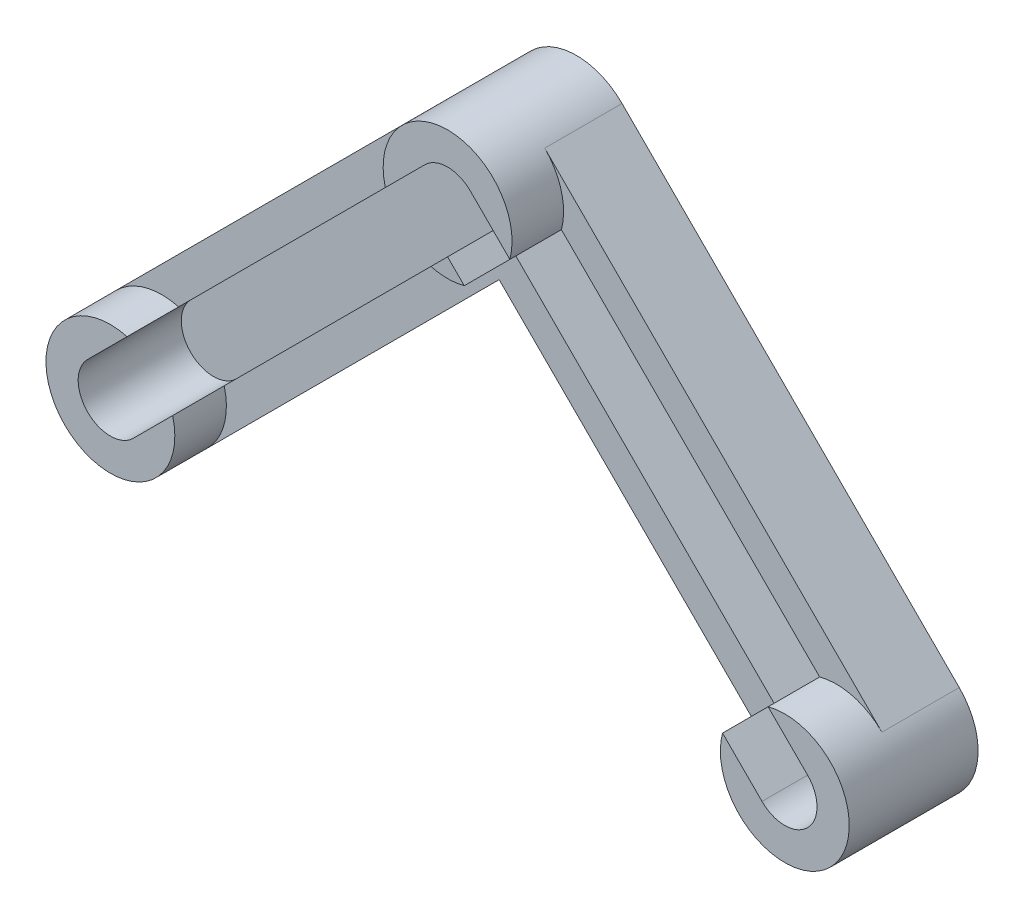
ISO-10303-21;
HEADER;
FILE_DESCRIPTION(('STEP AP214'),'2;1');
FILE_NAME('part.step','',(''),(''),'','','');
FILE_SCHEMA(('AUTOMOTIVE_DESIGN { 1 0 10303 214 1 1 1 1 }'));
ENDSEC;
DATA;
#1=APPLICATION_CONTEXT('core data for automotive mechanical design processes');
#2=APPLICATION_PROTOCOL_DEFINITION('international standard','automotive_design',2000,#1);
#3=PRODUCT_CONTEXT('',#1,'mechanical');
#4=PRODUCT('Part','Part','',(#3));
#5=PRODUCT_RELATED_PRODUCT_CATEGORY('part','',(#4));
#6=PRODUCT_DEFINITION_FORMATION('','',#4);
#7=PRODUCT_DEFINITION_CONTEXT('part definition',#1,'design');
#8=PRODUCT_DEFINITION('design','',#6,#7);
#9=PRODUCT_DEFINITION_SHAPE('','',#8);
#10=(LENGTH_UNIT() NAMED_UNIT(*) SI_UNIT(.MILLI.,.METRE.));
#11=(NAMED_UNIT(*) PLANE_ANGLE_UNIT() SI_UNIT($,.RADIAN.));
#12=(NAMED_UNIT(*) SI_UNIT($,.STERADIAN.) SOLID_ANGLE_UNIT());
#13=UNCERTAINTY_MEASURE_WITH_UNIT(LENGTH_MEASURE(1.E-05),#10,'distance_accuracy_value','');
#14=(GEOMETRIC_REPRESENTATION_CONTEXT(3) GLOBAL_UNCERTAINTY_ASSIGNED_CONTEXT((#13)) GLOBAL_UNIT_ASSIGNED_CONTEXT((#10,
#11,#12)) REPRESENTATION_CONTEXT('',''));
#15=CARTESIAN_POINT('',(0.,0.,0.));
#16=DIRECTION('',(0.,0.,1.));
#17=DIRECTION('',(1.,0.,0.));
#18=AXIS2_PLACEMENT_3D('',#15,#16,#17);
#19=CARTESIAN_POINT('',(14.0770342373392,-25.7488983177718,10.));
#20=DIRECTION('',(0.,0.,-1.));
#21=DIRECTION('',(-1.,0.,0.));
#22=AXIS2_PLACEMENT_3D('',#19,#20,#21);
#23=CYLINDRICAL_SURFACE('',#22,2.5);
#24=DIRECTION('',(0.,0.,-1.));
#25=VECTOR('',#24,1.);
#26=CARTESIAN_POINT('',(15.8448011903056,-23.9811313648055,10.));
#27=LINE('',#26,#25);
#28=CARTESIAN_POINT('',(15.8448011903057,-23.9811313648054,10.));
#29=VERTEX_POINT('',#28);
#30=CARTESIAN_POINT('',(15.8448011903057,-23.9811313648054,2.));
#31=VERTEX_POINT('',#30);
#32=EDGE_CURVE('E11',#29,#31,#27,.T.);
#33=ORIENTED_EDGE('',*,*,#32,.T.);
#34=CARTESIAN_POINT('',(14.0770342373392,-25.7488983177718,2.));
#35=DIRECTION('',(0.,0.,-1.));
#36=DIRECTION('',(-1.,0.,0.));
#37=AXIS2_PLACEMENT_3D('',#34,#35,#36);
#38=CIRCLE('',#37,2.5);
#39=CARTESIAN_POINT('',(12.3092672843729,-27.5166652707382,2.));
#40=VERTEX_POINT('',#39);
#41=EDGE_CURVE('E181',#31,#40,#38,.T.);
#42=ORIENTED_EDGE('',*,*,#41,.T.);
#43=DIRECTION('',(0.,0.,1.));
#44=VECTOR('',#43,1.);
#45=CARTESIAN_POINT('',(12.3092672843729,-27.5166652707382,2.));
#46=LINE('',#45,#44);
#47=CARTESIAN_POINT('',(12.3092672843729,-27.5166652707382,10.));
#48=VERTEX_POINT('',#47);
#49=EDGE_CURVE('E203',#40,#48,#46,.T.);
#50=ORIENTED_EDGE('',*,*,#49,.T.);
#51=CARTESIAN_POINT('',(14.0770342373392,-25.7488983177718,10.));
#52=DIRECTION('',(0.,0.,1.));
#53=DIRECTION('',(1.,0.,0.));
#54=AXIS2_PLACEMENT_3D('',#51,#52,#53);
#55=CIRCLE('',#54,2.5);
#56=EDGE_CURVE('E202',#48,#29,#55,.T.);
#57=ORIENTED_EDGE('',*,*,#56,.T.);
#58=EDGE_LOOP('',(#33,#42,#50,#57));
#59=FACE_BOUND('',#58,.T.);
#60=ADVANCED_FACE('F32',(#59),#23,.F.);
#61=CARTESIAN_POINT('',(-12.085916666563,0.414052586130462,10.));
#62=DIRECTION('',(0.,0.,-1.));
#63=DIRECTION('',(-1.,0.,0.));
#64=AXIS2_PLACEMENT_3D('',#61,#62,#63);
#65=CYLINDRICAL_SURFACE('',#64,5.);
#66=CARTESIAN_POINT('',(-12.085916666563,0.414052586130462,6.));
#67=DIRECTION('',(0.,0.,1.));
#68=DIRECTION('',(1.,0.,0.));
#69=AXIS2_PLACEMENT_3D('',#66,#67,#68);
#70=CIRCLE('',#69,5.);
#71=CARTESIAN_POINT('',(-13.3800118920756,-4.41557654531488,6.));
#72=VERTEX_POINT('',#71);
#73=CARTESIAN_POINT('',(-10.7918214410505,-4.41557654531489,6.));
#74=VERTEX_POINT('',#73);
#75=EDGE_CURVE('E278',#72,#74,#70,.T.);
#76=ORIENTED_EDGE('',*,*,#75,.T.);
#77=DIRECTION('',(0.,0.,-1.));
#78=VECTOR('',#77,1.);
#79=CARTESIAN_POINT('',(-10.7918214410505,-4.4155765453149,10.));
#80=LINE('',#79,#78);
#81=CARTESIAN_POINT('',(-10.7918214410505,-4.4155765453149,10.));
#82=VERTEX_POINT('',#81);
#83=EDGE_CURVE('E339',#74,#82,#80,.F.);
#84=ORIENTED_EDGE('',*,*,#83,.T.);
#85=CARTESIAN_POINT('',(-12.085916666563,0.414052586130462,10.));
#86=DIRECTION('',(0.,0.,1.));
#87=DIRECTION('',(1.,0.,0.));
#88=AXIS2_PLACEMENT_3D('',#85,#86,#87);
#89=CIRCLE('',#88,5.);
#90=CARTESIAN_POINT('',(-13.3800118920756,-4.41557654531488,10.));
#91=VERTEX_POINT('',#90);
#92=EDGE_CURVE('E281',#91,#82,#89,.T.);
#93=ORIENTED_EDGE('',*,*,#92,.F.);
#94=DIRECTION('',(0.,0.,-1.));
#95=VECTOR('',#94,1.);
#96=CARTESIAN_POINT('',(-13.3800118920756,-4.41557654531488,10.));
#97=LINE('',#96,#95);
#98=EDGE_CURVE('E346',#72,#91,#97,.F.);
#99=ORIENTED_EDGE('',*,*,#98,.F.);
#100=EDGE_LOOP('',(#76,#84,#93,#99));
#101=FACE_BOUND('',#100,.T.);
#102=ADVANCED_FACE('F344',(#101),#65,.T.);
#103=CARTESIAN_POINT('',(-12.085916666563,0.414052586130462,10.));
#104=DIRECTION('',(0.,0.,1.));
#105=DIRECTION('',(1.,0.,0.));
#106=AXIS2_PLACEMENT_3D('',#103,#104,#105);
#107=PLANE('',#106);
#108=DIRECTION('',(0.707106781186548,-0.707106781186547,0.));
#109=VECTOR('',#108,1.);
#110=CARTESIAN_POINT('',(12.3092672843729,-27.5166652707382,10.));
#111=LINE('',#110,#109);
#112=CARTESIAN_POINT('',(-12.085916666563,-3.12148131980232,10.));
#113=VERTEX_POINT('',#112);
#114=EDGE_CURVE('E198',#113,#82,#111,.T.);
#115=ORIENTED_EDGE('',*,*,#114,.F.);
#116=DIRECTION('',(0.707106781186547,0.707106781186548,0.));
#117=VECTOR('',#116,1.);
#118=CARTESIAN_POINT('',(-10.3181497135966,-1.35371436683589,10.));
#119=LINE('',#118,#117);
#120=EDGE_CURVE('E374',#91,#113,#119,.T.);
#121=ORIENTED_EDGE('',*,*,#120,.F.);
#122=ORIENTED_EDGE('',*,*,#92,.T.);
#123=EDGE_LOOP('',(#115,#121,#122));
#124=FACE_BOUND('',#123,.T.);
#125=ADVANCED_FACE('F427',(#124),#107,.T.);
#126=CARTESIAN_POINT('',(0.,0.,6.));
#127=DIRECTION('',(0.,0.,1.));
#128=DIRECTION('',(1.,0.,0.));
#129=AXIS2_PLACEMENT_3D('',#126,#127,#128);
#130=PLANE('',#129);
#131=DIRECTION('',(0.707106781186548,-0.707106781186547,0.));
#132=VECTOR('',#131,1.);
#133=CARTESIAN_POINT('',(-7.60369899318268,-7.60369899318268,6.));
#134=LINE('',#133,#132);
#135=CARTESIAN_POINT('',(9.24740510589387,-24.4548030922592,6.));
#136=VERTEX_POINT('',#135);
#137=EDGE_CURVE('E336',#74,#136,#134,.T.);
#138=ORIENTED_EDGE('',*,*,#137,.F.);
#139=ORIENTED_EDGE('',*,*,#75,.F.);
#140=DIRECTION('',(0.707106781186547,0.707106781186548,0.));
#141=VECTOR('',#140,1.);
#142=CARTESIAN_POINT('',(-10.3181497135966,-1.35371436683589,6.));
#143=LINE('',#142,#141);
#144=CARTESIAN_POINT('',(-33.4192384390202,-24.4548030922595,6.));
#145=VERTEX_POINT('',#144);
#146=EDGE_CURVE('E300',#145,#72,#143,.T.);
#147=ORIENTED_EDGE('',*,*,#146,.F.);
#148=CARTESIAN_POINT('',(-38.2488675704654,-25.7488983177717,6.));
#149=DIRECTION('',(0.,0.,1.));
#150=DIRECTION('',(1.,0.,0.));
#151=AXIS2_PLACEMENT_3D('',#148,#149,#150);
#152=CIRCLE('',#151,4.99999999999975);
#153=CARTESIAN_POINT('',(-34.7133336645327,-29.2844322237044,6.));
#154=VERTEX_POINT('',#153);
#155=EDGE_CURVE('E284',#145,#154,#152,.F.);
#156=ORIENTED_EDGE('',*,*,#155,.T.);
#157=DIRECTION('',(-0.707106781186551,-0.707106781186544,0.));
#158=VECTOR('',#157,1.);
#159=CARTESIAN_POINT('',(-34.7133336645327,-29.2844322237044,6.));
#160=LINE('',#159,#158);
#161=CARTESIAN_POINT('',(-12.0859166665631,-6.65701522573503,6.));
#162=VERTEX_POINT('',#161);
#163=EDGE_CURVE('E257',#162,#154,#160,.T.);
#164=ORIENTED_EDGE('',*,*,#163,.F.);
#165=DIRECTION('',(-0.707106781186547,0.707106781186547,0.));
#166=VECTOR('',#165,1.);
#167=CARTESIAN_POINT('',(-15.6214505724958,-3.12148131980235,6.));
#168=LINE('',#167,#166);
#169=CARTESIAN_POINT('',(10.5415003314065,-29.2844322237046,6.));
#170=VERTEX_POINT('',#169);
#171=EDGE_CURVE('E224',#170,#162,#168,.T.);
#172=ORIENTED_EDGE('',*,*,#171,.F.);
#173=CARTESIAN_POINT('',(14.0770342373392,-25.7488983177718,6.));
#174=DIRECTION('',(0.,0.,1.));
#175=DIRECTION('',(1.,0.,0.));
#176=AXIS2_PLACEMENT_3D('',#173,#174,#175);
#177=CIRCLE('',#176,5.);
#178=EDGE_CURVE('E221',#170,#136,#177,.F.);
#179=ORIENTED_EDGE('',*,*,#178,.T.);
#180=EDGE_LOOP('',(#138,#139,#147,#156,#164,#172,#179));
#181=FACE_BOUND('',#180,.T.);
#182=ADVANCED_FACE('F296',(#181),#130,.T.);
#183=CARTESIAN_POINT('',(-38.2488675704654,-25.7488983177717,10.));
#184=DIRECTION('',(0.,0.,-1.));
#185=DIRECTION('',(-1.,0.,0.));
#186=AXIS2_PLACEMENT_3D('',#183,#184,#185);
#187=CYLINDRICAL_SURFACE('',#186,2.49999999999976);
#188=DIRECTION('',(0.,0.,1.));
#189=VECTOR('',#188,1.);
#190=CARTESIAN_POINT('',(-40.0166345234318,-23.9811313648053,2.));
#191=LINE('',#190,#189);
#192=CARTESIAN_POINT('',(-40.0166345234318,-23.9811313648053,2.));
#193=VERTEX_POINT('',#192);
#194=CARTESIAN_POINT('',(-40.0166345234318,-23.9811313648053,10.));
#195=VERTEX_POINT('',#194);
#196=EDGE_CURVE('E214',#193,#195,#191,.T.);
#197=ORIENTED_EDGE('',*,*,#196,.T.);
#198=CARTESIAN_POINT('',(-38.2488675704654,-25.7488983177717,10.));
#199=DIRECTION('',(0.,0.,1.));
#200=DIRECTION('',(1.,0.,0.));
#201=AXIS2_PLACEMENT_3D('',#198,#199,#200);
#202=CIRCLE('',#201,2.49999999999976);
#203=CARTESIAN_POINT('',(-36.4811006174989,-27.5166652707382,10.));
#204=VERTEX_POINT('',#203);
#205=EDGE_CURVE('E244',#195,#204,#202,.T.);
#206=ORIENTED_EDGE('',*,*,#205,.T.);
#207=DIRECTION('',(0.,0.,-1.));
#208=VECTOR('',#207,1.);
#209=CARTESIAN_POINT('',(-36.4811006174992,-27.5166652707379,10.));
#210=LINE('',#209,#208);
#211=CARTESIAN_POINT('',(-36.4811006174992,-27.5166652707379,2.));
#212=VERTEX_POINT('',#211);
#213=EDGE_CURVE('E251',#204,#212,#210,.T.);
#214=ORIENTED_EDGE('',*,*,#213,.T.);
#215=CARTESIAN_POINT('',(-38.2488675704654,-25.7488983177717,2.));
#216=DIRECTION('',(0.,0.,-1.));
#217=DIRECTION('',(-1.,0.,0.));
#218=AXIS2_PLACEMENT_3D('',#215,#216,#217);
#219=CIRCLE('',#218,2.49999999999973);
#220=EDGE_CURVE('E366',#212,#193,#219,.T.);
#221=ORIENTED_EDGE('',*,*,#220,.T.);
#222=EDGE_LOOP('',(#197,#206,#214,#221));
#223=FACE_BOUND('',#222,.T.);
#224=ADVANCED_FACE('F410',(#223),#187,.F.);
#225=CARTESIAN_POINT('',(-12.085916666563,0.414052586130462,10.));
#226=DIRECTION('',(0.,0.,-1.));
#227=DIRECTION('',(-1.,0.,0.));
#228=AXIS2_PLACEMENT_3D('',#225,#226,#227);
#229=CYLINDRICAL_SURFACE('',#228,2.5);
#230=DIRECTION('',(0.,0.,-1.));
#231=VECTOR('',#230,1.);
#232=CARTESIAN_POINT('',(-10.3181497135966,2.1818195390968,10.));
#233=LINE('',#232,#231);
#234=CARTESIAN_POINT('',(-10.3181497135966,2.1818195390969,10.));
#235=VERTEX_POINT('',#234);
#236=CARTESIAN_POINT('',(-10.3181497135966,2.1818195390968,2.));
#237=VERTEX_POINT('',#236);
#238=EDGE_CURVE('E196',#235,#237,#233,.T.);
#239=ORIENTED_EDGE('',*,*,#238,.F.);
#240=CARTESIAN_POINT('',(-12.085916666563,0.414052586130462,10.));
#241=DIRECTION('',(0.,0.,1.));
#242=DIRECTION('',(1.,0.,0.));
#243=AXIS2_PLACEMENT_3D('',#240,#241,#242);
#244=CIRCLE('',#243,2.5);
#245=CARTESIAN_POINT('',(-13.8536836195295,2.18181953909697,10.));
#246=VERTEX_POINT('',#245);
#247=EDGE_CURVE('E277',#235,#246,#244,.T.);
#248=ORIENTED_EDGE('',*,*,#247,.T.);
#249=DIRECTION('',(0.,0.,1.));
#250=VECTOR('',#249,1.);
#251=CARTESIAN_POINT('',(-13.8536836195295,2.18181953909697,2.));
#252=LINE('',#251,#250);
#253=CARTESIAN_POINT('',(-13.8536836195294,2.18181953909683,2.));
#254=VERTEX_POINT('',#253);
#255=EDGE_CURVE('E208',#254,#246,#252,.T.);
#256=ORIENTED_EDGE('',*,*,#255,.F.);
#257=CARTESIAN_POINT('',(-12.085916666563,0.414052586130462,2.));
#258=DIRECTION('',(0.,0.,-1.));
#259=DIRECTION('',(-1.,0.,0.));
#260=AXIS2_PLACEMENT_3D('',#257,#258,#259);
#261=CIRCLE('',#260,2.5);
#262=EDGE_CURVE('E361',#254,#237,#261,.T.);
#263=ORIENTED_EDGE('',*,*,#262,.T.);
#264=EDGE_LOOP('',(#239,#248,#256,#263));
#265=FACE_BOUND('',#264,.T.);
#266=ADVANCED_FACE('F400',(#265),#229,.F.);
#267=CARTESIAN_POINT('',(-7.25628753511764,-0.880042639382038,10.));
#268=VERTEX_POINT('',#267);
#269=CARTESIAN_POINT('',(-16.9155457980084,-0.880042639381941,10.));
#270=VERTEX_POINT('',#269);
#271=EDGE_CURVE('E285',#268,#270,#89,.T.);
#272=ORIENTED_EDGE('',*,*,#271,.F.);
#273=DIRECTION('',(0.,0.,-1.));
#274=VECTOR('',#273,1.);
#275=CARTESIAN_POINT('',(-7.25628753511764,-0.880042639382036,10.));
#276=LINE('',#275,#274);
#277=CARTESIAN_POINT('',(-7.25628753511764,-0.880042639382037,6.));
#278=VERTEX_POINT('',#277);
#279=EDGE_CURVE('E379',#268,#278,#276,.T.);
#280=ORIENTED_EDGE('',*,*,#279,.T.);
#281=CARTESIAN_POINT('',(-8.55038276063024,3.94958649206317,6.));
#282=VERTEX_POINT('',#281);
#283=EDGE_CURVE('E269',#278,#282,#70,.T.);
#284=ORIENTED_EDGE('',*,*,#283,.T.);
#285=DIRECTION('',(0.,0.,-1.));
#286=VECTOR('',#285,1.);
#287=CARTESIAN_POINT('',(-8.55038276063024,3.94958649206317,6.));
#288=LINE('',#287,#286);
#289=CARTESIAN_POINT('',(-8.55038276063024,3.94958649206317,0.));
#290=VERTEX_POINT('',#289);
#291=EDGE_CURVE('E237',#282,#290,#288,.T.);
#292=ORIENTED_EDGE('',*,*,#291,.T.);
#293=CARTESIAN_POINT('',(-12.085916666563,0.414052586130462,0.));
#294=DIRECTION('',(0.,0.,1.));
#295=DIRECTION('',(1.,0.,0.));
#296=AXIS2_PLACEMENT_3D('',#293,#294,#295);
#297=CIRCLE('',#296,5.);
#298=CARTESIAN_POINT('',(-15.6214505724957,3.94958649206322,0.));
#299=VERTEX_POINT('',#298);
#300=EDGE_CURVE('E280',#290,#299,#297,.T.);
#301=ORIENTED_EDGE('',*,*,#300,.T.);
#302=DIRECTION('',(0.,0.,-1.));
#303=VECTOR('',#302,1.);
#304=CARTESIAN_POINT('',(-15.6214505724957,3.94958649206319,6.));
#305=LINE('',#304,#303);
#306=CARTESIAN_POINT('',(-15.6214505724957,3.94958649206322,6.));
#307=VERTEX_POINT('',#306);
#308=EDGE_CURVE('E55',#307,#299,#305,.T.);
#309=ORIENTED_EDGE('',*,*,#308,.F.);
#310=CARTESIAN_POINT('',(-16.9155457980084,-0.880042639381941,6.));
#311=VERTEX_POINT('',#310);
#312=EDGE_CURVE('E275',#307,#311,#70,.T.);
#313=ORIENTED_EDGE('',*,*,#312,.T.);
#314=DIRECTION('',(0.,0.,-1.));
#315=VECTOR('',#314,1.);
#316=CARTESIAN_POINT('',(-16.9155457980084,-0.880042639381937,10.));
#317=LINE('',#316,#315);
#318=EDGE_CURVE('E368',#270,#311,#317,.T.);
#319=ORIENTED_EDGE('',*,*,#318,.F.);
#320=EDGE_LOOP('',(#272,#280,#284,#292,#301,#309,#313,#319));
#321=FACE_BOUND('',#320,.T.);
#322=ADVANCED_FACE('F34',(#321),#65,.T.);
#323=DIRECTION('',(-0.707106781186548,0.707106781186547,0.));
#324=VECTOR('',#323,1.);
#325=CARTESIAN_POINT('',(-10.3181497135966,2.1818195390969,10.));
#326=LINE('',#325,#324);
#327=EDGE_CURVE('E190',#268,#235,#326,.T.);
#328=ORIENTED_EDGE('',*,*,#327,.F.);
#329=ORIENTED_EDGE('',*,*,#271,.T.);
#330=DIRECTION('',(-0.707106781186547,-0.707106781186547,0.));
#331=VECTOR('',#330,1.);
#332=CARTESIAN_POINT('',(-40.0166345234318,-23.9811313648053,10.));
#333=LINE('',#332,#331);
#334=EDGE_CURVE('E375',#246,#270,#333,.T.);
#335=ORIENTED_EDGE('',*,*,#334,.F.);
#336=ORIENTED_EDGE('',*,*,#247,.F.);
#337=EDGE_LOOP('',(#328,#329,#335,#336));
#338=FACE_BOUND('',#337,.T.);
#339=ADVANCED_FACE('F397',(#338),#107,.T.);
#340=CARTESIAN_POINT('',(-38.2488675704654,-25.7488983177717,10.));
#341=DIRECTION('',(0.,0.,1.));
#342=DIRECTION('',(1.,0.,0.));
#343=AXIS2_PLACEMENT_3D('',#340,#341,#342);
#344=PLANE('',#343);
#345=ORIENTED_EDGE('',*,*,#205,.F.);
#346=CARTESIAN_POINT('',(-36.954772344953,-20.9192691863265,10.));
#347=VERTEX_POINT('',#346);
#348=EDGE_CURVE('E378',#347,#195,#333,.T.);
#349=ORIENTED_EDGE('',*,*,#348,.F.);
#350=CARTESIAN_POINT('',(-38.2488675704654,-25.7488983177717,10.));
#351=DIRECTION('',(0.,0.,1.));
#352=DIRECTION('',(1.,0.,0.));
#353=AXIS2_PLACEMENT_3D('',#350,#351,#352);
#354=CIRCLE('',#353,4.99999999999975);
#355=CARTESIAN_POINT('',(-33.4192384390202,-24.4548030922595,10.));
#356=VERTEX_POINT('',#355);
#357=EDGE_CURVE('E248',#347,#356,#354,.T.);
#358=ORIENTED_EDGE('',*,*,#357,.T.);
#359=EDGE_CURVE('E372',#204,#356,#119,.T.);
#360=ORIENTED_EDGE('',*,*,#359,.F.);
#361=EDGE_LOOP('',(#345,#349,#358,#360));
#362=FACE_BOUND('',#361,.T.);
#363=ADVANCED_FACE('F414',(#362),#344,.T.);
#364=CARTESIAN_POINT('',(-38.2488675704654,-25.7488983177717,10.));
#365=DIRECTION('',(0.,0.,-1.));
#366=DIRECTION('',(-1.,0.,0.));
#367=AXIS2_PLACEMENT_3D('',#364,#365,#366);
#368=CYLINDRICAL_SURFACE('',#367,4.99999999999975);
#369=DIRECTION('',(0.,0.,-1.));
#370=VECTOR('',#369,1.);
#371=CARTESIAN_POINT('',(-36.954772344953,-20.9192691863265,10.));
#372=LINE('',#371,#370);
#373=CARTESIAN_POINT('',(-36.954772344953,-20.9192691863265,6.));
#374=VERTEX_POINT('',#373);
#375=EDGE_CURVE('E350',#374,#347,#372,.F.);
#376=ORIENTED_EDGE('',*,*,#375,.F.);
#377=CARTESIAN_POINT('',(-41.7844014763981,-22.2133644118389,6.));
#378=VERTEX_POINT('',#377);
#379=EDGE_CURVE('E40',#378,#374,#152,.F.);
#380=ORIENTED_EDGE('',*,*,#379,.F.);
#381=DIRECTION('',(0.,0.,-1.));
#382=VECTOR('',#381,1.);
#383=CARTESIAN_POINT('',(-41.7844014763981,-22.2133644118389,6.));
#384=LINE('',#383,#382);
#385=CARTESIAN_POINT('',(-41.7844014763981,-22.2133644118389,0.));
#386=VERTEX_POINT('',#385);
#387=EDGE_CURVE('E270',#378,#386,#384,.T.);
#388=ORIENTED_EDGE('',*,*,#387,.T.);
#389=CARTESIAN_POINT('',(-38.2488675704654,-25.7488983177717,0.));
#390=DIRECTION('',(0.,0.,1.));
#391=DIRECTION('',(1.,0.,0.));
#392=AXIS2_PLACEMENT_3D('',#389,#390,#391);
#393=CIRCLE('',#392,4.99999999999975);
#394=CARTESIAN_POINT('',(-34.7133336645327,-29.2844322237044,0.));
#395=VERTEX_POINT('',#394);
#396=EDGE_CURVE('E247',#386,#395,#393,.T.);
#397=ORIENTED_EDGE('',*,*,#396,.T.);
#398=DIRECTION('',(0.,0.,-1.));
#399=VECTOR('',#398,1.);
#400=CARTESIAN_POINT('',(-34.7133336645327,-29.2844322237044,6.));
#401=LINE('',#400,#399);
#402=EDGE_CURVE('E264',#154,#395,#401,.T.);
#403=ORIENTED_EDGE('',*,*,#402,.F.);
#404=ORIENTED_EDGE('',*,*,#155,.F.);
#405=DIRECTION('',(0.,0.,-1.));
#406=VECTOR('',#405,1.);
#407=CARTESIAN_POINT('',(-33.4192384390202,-24.4548030922595,10.));
#408=LINE('',#407,#406);
#409=EDGE_CURVE('E351',#356,#145,#408,.T.);
#410=ORIENTED_EDGE('',*,*,#409,.F.);
#411=ORIENTED_EDGE('',*,*,#357,.F.);
#412=EDGE_LOOP('',(#376,#380,#388,#397,#403,#404,#410,#411));
#413=FACE_BOUND('',#412,.T.);
#414=ADVANCED_FACE('F308',(#413),#368,.T.);
#415=DIRECTION('',(-0.707106781186547,-0.707106781186547,0.));
#416=VECTOR('',#415,1.);
#417=CARTESIAN_POINT('',(-40.0166345234318,-23.9811313648053,6.));
#418=LINE('',#417,#416);
#419=EDGE_CURVE('E355',#311,#374,#418,.T.);
#420=ORIENTED_EDGE('',*,*,#419,.F.);
#421=ORIENTED_EDGE('',*,*,#312,.F.);
#422=DIRECTION('',(0.707106781186551,0.707106781186544,0.));
#423=VECTOR('',#422,1.);
#424=CARTESIAN_POINT('',(-15.6214505724957,3.94958649206319,6.));
#425=LINE('',#424,#423);
#426=EDGE_CURVE('E260',#378,#307,#425,.T.);
#427=ORIENTED_EDGE('',*,*,#426,.F.);
#428=ORIENTED_EDGE('',*,*,#379,.T.);
#429=EDGE_LOOP('',(#420,#421,#427,#428));
#430=FACE_BOUND('',#429,.T.);
#431=ADVANCED_FACE('F416',(#430),#130,.T.);
#432=CARTESIAN_POINT('',(-12.085916666563,0.414052586130462,0.));
#433=DIRECTION('',(0.,0.,1.));
#434=DIRECTION('',(1.,0.,0.));
#435=AXIS2_PLACEMENT_3D('',#432,#433,#434);
#436=PLANE('',#435);
#437=DIRECTION('',(0.707106781186551,0.707106781186544,0.));
#438=VECTOR('',#437,1.);
#439=CARTESIAN_POINT('',(-15.6214505724957,3.94958649206319,0.));
#440=LINE('',#439,#438);
#441=EDGE_CURVE('E261',#386,#299,#440,.T.);
#442=ORIENTED_EDGE('',*,*,#441,.T.);
#443=ORIENTED_EDGE('',*,*,#300,.F.);
#444=DIRECTION('',(0.707106781186546,-0.707106781186548,0.));
#445=VECTOR('',#444,1.);
#446=CARTESIAN_POINT('',(17.612568143272,-22.2133644118391,0.));
#447=LINE('',#446,#445);
#448=CARTESIAN_POINT('',(17.612568143272,-22.2133644118391,0.));
#449=VERTEX_POINT('',#448);
#450=EDGE_CURVE('E227',#290,#449,#447,.T.);
#451=ORIENTED_EDGE('',*,*,#450,.T.);
#452=CARTESIAN_POINT('',(14.0770342373392,-25.7488983177718,0.));
#453=DIRECTION('',(0.,0.,1.));
#454=DIRECTION('',(1.,0.,0.));
#455=AXIS2_PLACEMENT_3D('',#452,#453,#454);
#456=CIRCLE('',#455,5.);
#457=CARTESIAN_POINT('',(10.5415003314065,-29.2844322237046,0.));
#458=VERTEX_POINT('',#457);
#459=EDGE_CURVE('E207',#458,#449,#456,.T.);
#460=ORIENTED_EDGE('',*,*,#459,.F.);
#461=DIRECTION('',(-0.707106781186547,0.707106781186547,0.));
#462=VECTOR('',#461,1.);
#463=CARTESIAN_POINT('',(-15.6214505724958,-3.12148131980235,0.));
#464=LINE('',#463,#462);
#465=CARTESIAN_POINT('',(-12.0859166665631,-6.65701522573503,0.));
#466=VERTEX_POINT('',#465);
#467=EDGE_CURVE('E47',#458,#466,#464,.T.);
#468=ORIENTED_EDGE('',*,*,#467,.T.);
#469=DIRECTION('',(-0.707106781186551,-0.707106781186544,0.));
#470=VECTOR('',#469,1.);
#471=CARTESIAN_POINT('',(-34.7133336645327,-29.2844322237044,0.));
#472=LINE('',#471,#470);
#473=EDGE_CURVE('E256',#466,#395,#472,.T.);
#474=ORIENTED_EDGE('',*,*,#473,.T.);
#475=ORIENTED_EDGE('',*,*,#396,.F.);
#476=EDGE_LOOP('',(#442,#443,#451,#460,#468,#474,#475));
#477=FACE_BOUND('',#476,.T.);
#478=ADVANCED_FACE('F310',(#477),#436,.F.);
#479=CARTESIAN_POINT('',(-15.6214505724957,3.94958649206319,6.));
#480=DIRECTION('',(-0.707106781186544,0.707106781186551,0.));
#481=DIRECTION('',(-0.707106781186551,-0.707106781186544,0.));
#482=AXIS2_PLACEMENT_3D('',#479,#480,#481);
#483=PLANE('',#482);
#484=ORIENTED_EDGE('',*,*,#441,.F.);
#485=ORIENTED_EDGE('',*,*,#387,.F.);
#486=ORIENTED_EDGE('',*,*,#426,.T.);
#487=ORIENTED_EDGE('',*,*,#308,.T.);
#488=EDGE_LOOP('',(#484,#485,#486,#487));
#489=FACE_BOUND('',#488,.T.);
#490=ADVANCED_FACE('F313',(#489),#483,.T.);
#491=CARTESIAN_POINT('',(-34.7133336645327,-29.2844322237044,6.));
#492=DIRECTION('',(0.707106781186544,-0.707106781186551,0.));
#493=DIRECTION('',(0.707106781186551,0.707106781186544,0.));
#494=AXIS2_PLACEMENT_3D('',#491,#492,#493);
#495=PLANE('',#494);
#496=DIRECTION('',(0.,0.,-1.));
#497=VECTOR('',#496,1.);
#498=CARTESIAN_POINT('',(-12.0859166665631,-6.65701522573503,6.));
#499=LINE('',#498,#497);
#500=EDGE_CURVE('E236',#162,#466,#499,.T.);
#501=ORIENTED_EDGE('',*,*,#500,.F.);
#502=ORIENTED_EDGE('',*,*,#163,.T.);
#503=ORIENTED_EDGE('',*,*,#402,.T.);
#504=ORIENTED_EDGE('',*,*,#473,.F.);
#505=EDGE_LOOP('',(#501,#502,#503,#504));
#506=FACE_BOUND('',#505,.T.);
#507=ADVANCED_FACE('F306',(#506),#495,.T.);
#508=DIRECTION('',(-0.707106781186548,0.707106781186547,0.));
#509=VECTOR('',#508,1.);
#510=CARTESIAN_POINT('',(-4.06816508724984,-4.06816508724984,6.));
#511=LINE('',#510,#509);
#512=CARTESIAN_POINT('',(12.7829390118268,-20.9192691863264,6.));
#513=VERTEX_POINT('',#512);
#514=EDGE_CURVE('E326',#513,#278,#511,.T.);
#515=ORIENTED_EDGE('',*,*,#514,.F.);
#516=CARTESIAN_POINT('',(17.612568143272,-22.2133644118391,6.));
#517=VERTEX_POINT('',#516);
#518=EDGE_CURVE('E219',#513,#517,#177,.F.);
#519=ORIENTED_EDGE('',*,*,#518,.T.);
#520=DIRECTION('',(0.707106781186546,-0.707106781186548,0.));
#521=VECTOR('',#520,1.);
#522=CARTESIAN_POINT('',(17.612568143272,-22.2133644118391,6.));
#523=LINE('',#522,#521);
#524=EDGE_CURVE('E226',#282,#517,#523,.T.);
#525=ORIENTED_EDGE('',*,*,#524,.F.);
#526=ORIENTED_EDGE('',*,*,#283,.F.);
#527=EDGE_LOOP('',(#515,#519,#525,#526));
#528=FACE_BOUND('',#527,.T.);
#529=ADVANCED_FACE('F324',(#528),#130,.T.);
#530=CARTESIAN_POINT('',(-15.6214505724958,-3.12148131980235,6.));
#531=DIRECTION('',(-0.707106781186548,-0.707106781186548,0.));
#532=DIRECTION('',(0.707106781186548,-0.707106781186548,0.));
#533=AXIS2_PLACEMENT_3D('',#530,#531,#532);
#534=PLANE('',#533);
#535=ORIENTED_EDGE('',*,*,#171,.T.);
#536=ORIENTED_EDGE('',*,*,#500,.T.);
#537=ORIENTED_EDGE('',*,*,#467,.F.);
#538=DIRECTION('',(0.,0.,-1.));
#539=VECTOR('',#538,1.);
#540=CARTESIAN_POINT('',(10.5415003314065,-29.2844322237046,6.));
#541=LINE('',#540,#539);
#542=EDGE_CURVE('E230',#170,#458,#541,.T.);
#543=ORIENTED_EDGE('',*,*,#542,.F.);
#544=EDGE_LOOP('',(#535,#536,#537,#543));
#545=FACE_BOUND('',#544,.T.);
#546=ADVANCED_FACE('F335',(#545),#534,.T.);
#547=CARTESIAN_POINT('',(17.612568143272,-22.2133644118391,6.));
#548=DIRECTION('',(0.707106781186549,0.707106781186547,0.));
#549=DIRECTION('',(-0.707106781186547,0.707106781186549,0.));
#550=AXIS2_PLACEMENT_3D('',#547,#548,#549);
#551=PLANE('',#550);
#552=ORIENTED_EDGE('',*,*,#450,.F.);
#553=ORIENTED_EDGE('',*,*,#291,.F.);
#554=ORIENTED_EDGE('',*,*,#524,.T.);
#555=DIRECTION('',(0.,0.,-1.));
#556=VECTOR('',#555,1.);
#557=CARTESIAN_POINT('',(17.612568143272,-22.2133644118391,6.));
#558=LINE('',#557,#556);
#559=EDGE_CURVE('E234',#517,#449,#558,.T.);
#560=ORIENTED_EDGE('',*,*,#559,.T.);
#561=EDGE_LOOP('',(#552,#553,#554,#560));
#562=FACE_BOUND('',#561,.T.);
#563=ADVANCED_FACE('F320',(#562),#551,.T.);
#564=CARTESIAN_POINT('',(14.0770342373392,-25.7488983177718,10.));
#565=DIRECTION('',(0.,0.,1.));
#566=DIRECTION('',(1.,0.,0.));
#567=AXIS2_PLACEMENT_3D('',#564,#565,#566);
#568=PLANE('',#567);
#569=CARTESIAN_POINT('',(9.24740510589387,-24.4548030922592,10.));
#570=VERTEX_POINT('',#569);
#571=EDGE_CURVE('E389',#570,#48,#111,.T.);
#572=ORIENTED_EDGE('',*,*,#571,.F.);
#573=CARTESIAN_POINT('',(14.0770342373392,-25.7488983177718,10.));
#574=DIRECTION('',(0.,0.,1.));
#575=DIRECTION('',(1.,0.,0.));
#576=AXIS2_PLACEMENT_3D('',#573,#574,#575);
#577=CIRCLE('',#576,5.);
#578=CARTESIAN_POINT('',(12.7829390118268,-20.9192691863264,10.));
#579=VERTEX_POINT('',#578);
#580=EDGE_CURVE('E211',#570,#579,#577,.T.);
#581=ORIENTED_EDGE('',*,*,#580,.T.);
#582=EDGE_CURVE('E391',#29,#579,#326,.T.);
#583=ORIENTED_EDGE('',*,*,#582,.F.);
#584=ORIENTED_EDGE('',*,*,#56,.F.);
#585=EDGE_LOOP('',(#572,#581,#583,#584));
#586=FACE_BOUND('',#585,.T.);
#587=ADVANCED_FACE('F436',(#586),#568,.T.);
#588=CARTESIAN_POINT('',(14.0770342373392,-25.7488983177718,10.));
#589=DIRECTION('',(0.,0.,-1.));
#590=DIRECTION('',(-1.,0.,0.));
#591=AXIS2_PLACEMENT_3D('',#588,#589,#590);
#592=CYLINDRICAL_SURFACE('',#591,5.);
#593=ORIENTED_EDGE('',*,*,#580,.F.);
#594=DIRECTION('',(0.,0.,-1.));
#595=VECTOR('',#594,1.);
#596=CARTESIAN_POINT('',(9.24740510589387,-24.4548030922592,10.));
#597=LINE('',#596,#595);
#598=EDGE_CURVE('E340',#570,#136,#597,.T.);
#599=ORIENTED_EDGE('',*,*,#598,.T.);
#600=ORIENTED_EDGE('',*,*,#178,.F.);
#601=ORIENTED_EDGE('',*,*,#542,.T.);
#602=ORIENTED_EDGE('',*,*,#459,.T.);
#603=ORIENTED_EDGE('',*,*,#559,.F.);
#604=ORIENTED_EDGE('',*,*,#518,.F.);
#605=DIRECTION('',(0.,0.,-1.));
#606=VECTOR('',#605,1.);
#607=CARTESIAN_POINT('',(12.7829390118268,-20.9192691863264,10.));
#608=LINE('',#607,#606);
#609=EDGE_CURVE('E331',#513,#579,#608,.F.);
#610=ORIENTED_EDGE('',*,*,#609,.T.);
#611=EDGE_LOOP('',(#593,#599,#600,#601,#602,#603,#604,#610));
#612=FACE_BOUND('',#611,.T.);
#613=ADVANCED_FACE('F330',(#612),#592,.T.);
#614=CARTESIAN_POINT('',(-40.0166345234318,-23.9811313648053,2.));
#615=DIRECTION('',(-0.707106781186548,0.707106781186548,0.));
#616=DIRECTION('',(-0.707106781186547,-0.707106781186548,0.));
#617=AXIS2_PLACEMENT_3D('',#614,#615,#616);
#618=PLANE('',#617);
#619=ORIENTED_EDGE('',*,*,#255,.T.);
#620=ORIENTED_EDGE('',*,*,#334,.T.);
#621=ORIENTED_EDGE('',*,*,#318,.T.);
#622=ORIENTED_EDGE('',*,*,#419,.T.);
#623=ORIENTED_EDGE('',*,*,#375,.T.);
#624=ORIENTED_EDGE('',*,*,#348,.T.);
#625=ORIENTED_EDGE('',*,*,#196,.F.);
#626=DIRECTION('',(-0.707106781186547,-0.707106781186547,0.));
#627=VECTOR('',#626,1.);
#628=CARTESIAN_POINT('',(-40.0166345234318,-23.9811313648053,2.));
#629=LINE('',#628,#627);
#630=EDGE_CURVE('E354',#254,#193,#629,.T.);
#631=ORIENTED_EDGE('',*,*,#630,.F.);
#632=EDGE_LOOP('',(#619,#620,#621,#622,#623,#624,#625,#631));
#633=FACE_BOUND('',#632,.T.);
#634=ADVANCED_FACE('F403',(#633),#618,.F.);
#635=CARTESIAN_POINT('',(-10.3181497135966,-1.35371436683589,2.));
#636=DIRECTION('',(0.707106781186548,-0.707106781186547,0.));
#637=DIRECTION('',(0.707106781186547,0.707106781186548,0.));
#638=AXIS2_PLACEMENT_3D('',#635,#636,#637);
#639=PLANE('',#638);
#640=ORIENTED_EDGE('',*,*,#120,.T.);
#641=DIRECTION('',(0.,0.,-1.));
#642=VECTOR('',#641,1.);
#643=CARTESIAN_POINT('',(-12.085916666563,-3.12148131980232,2.));
#644=LINE('',#643,#642);
#645=CARTESIAN_POINT('',(-12.085916666563,-3.12148131980232,2.));
#646=VERTEX_POINT('',#645);
#647=EDGE_CURVE('E385',#113,#646,#644,.T.);
#648=ORIENTED_EDGE('',*,*,#647,.T.);
#649=DIRECTION('',(0.707106781186547,0.707106781186548,0.));
#650=VECTOR('',#649,1.);
#651=CARTESIAN_POINT('',(-10.3181497135966,-1.35371436683589,2.));
#652=LINE('',#651,#650);
#653=EDGE_CURVE('E358',#212,#646,#652,.T.);
#654=ORIENTED_EDGE('',*,*,#653,.F.);
#655=ORIENTED_EDGE('',*,*,#213,.F.);
#656=ORIENTED_EDGE('',*,*,#359,.T.);
#657=ORIENTED_EDGE('',*,*,#409,.T.);
#658=ORIENTED_EDGE('',*,*,#146,.T.);
#659=ORIENTED_EDGE('',*,*,#98,.T.);
#660=EDGE_LOOP('',(#640,#648,#654,#655,#656,#657,#658,#659));
#661=FACE_BOUND('',#660,.T.);
#662=ADVANCED_FACE('F353',(#661),#639,.F.);
#663=CARTESIAN_POINT('',(0.,0.,2.));
#664=DIRECTION('',(0.,0.,-1.));
#665=DIRECTION('',(-1.,0.,0.));
#666=AXIS2_PLACEMENT_3D('',#663,#664,#665);
#667=PLANE('',#666);
#668=DIRECTION('',(0.707106781186548,-0.707106781186547,0.));
#669=VECTOR('',#668,1.);
#670=CARTESIAN_POINT('',(12.3092672843729,-27.5166652707382,2.));
#671=LINE('',#670,#669);
#672=EDGE_CURVE('E187',#646,#40,#671,.T.);
#673=ORIENTED_EDGE('',*,*,#672,.T.);
#674=ORIENTED_EDGE('',*,*,#41,.F.);
#675=DIRECTION('',(-0.707106781186548,0.707106781186547,0.));
#676=VECTOR('',#675,1.);
#677=CARTESIAN_POINT('',(-10.3181497135966,2.1818195390969,2.));
#678=LINE('',#677,#676);
#679=EDGE_CURVE('E184',#31,#237,#678,.T.);
#680=ORIENTED_EDGE('',*,*,#679,.T.);
#681=ORIENTED_EDGE('',*,*,#262,.F.);
#682=ORIENTED_EDGE('',*,*,#630,.T.);
#683=ORIENTED_EDGE('',*,*,#220,.F.);
#684=ORIENTED_EDGE('',*,*,#653,.T.);
#685=EDGE_LOOP('',(#673,#674,#680,#681,#682,#683,#684));
#686=FACE_BOUND('',#685,.T.);
#687=ADVANCED_FACE('F183',(#686),#667,.F.);
#688=CARTESIAN_POINT('',(-10.3181497135966,2.1818195390969,2.));
#689=DIRECTION('',(0.707106781186547,0.707106781186548,0.));
#690=DIRECTION('',(-0.707106781186548,0.707106781186547,0.));
#691=AXIS2_PLACEMENT_3D('',#688,#689,#690);
#692=PLANE('',#691);
#693=ORIENTED_EDGE('',*,*,#327,.T.);
#694=ORIENTED_EDGE('',*,*,#238,.T.);
#695=ORIENTED_EDGE('',*,*,#679,.F.);
#696=ORIENTED_EDGE('',*,*,#32,.F.);
#697=ORIENTED_EDGE('',*,*,#582,.T.);
#698=ORIENTED_EDGE('',*,*,#609,.F.);
#699=ORIENTED_EDGE('',*,*,#514,.T.);
#700=ORIENTED_EDGE('',*,*,#279,.F.);
#701=EDGE_LOOP('',(#693,#694,#695,#696,#697,#698,#699,#700));
#702=FACE_BOUND('',#701,.T.);
#703=ADVANCED_FACE('F194',(#702),#692,.F.);
#704=CARTESIAN_POINT('',(12.3092672843729,-27.5166652707382,2.));
#705=DIRECTION('',(-0.707106781186547,-0.707106781186548,0.));
#706=DIRECTION('',(0.707106781186548,-0.707106781186547,0.));
#707=AXIS2_PLACEMENT_3D('',#704,#705,#706);
#708=PLANE('',#707);
#709=ORIENTED_EDGE('',*,*,#137,.T.);
#710=ORIENTED_EDGE('',*,*,#598,.F.);
#711=ORIENTED_EDGE('',*,*,#571,.T.);
#712=ORIENTED_EDGE('',*,*,#49,.F.);
#713=ORIENTED_EDGE('',*,*,#672,.F.);
#714=ORIENTED_EDGE('',*,*,#647,.F.);
#715=ORIENTED_EDGE('',*,*,#114,.T.);
#716=ORIENTED_EDGE('',*,*,#83,.F.);
#717=EDGE_LOOP('',(#709,#710,#711,#712,#713,#714,#715,#716));
#718=FACE_BOUND('',#717,.T.);
#719=ADVANCED_FACE('F461',(#718),#708,.F.);
#720=CLOSED_SHELL('',(#60,#102,#125,#182,#224,#266,#322,#339,#363,#414,#431,#478,#490,#507,#529,
#546,#563,#587,#613,#634,#662,#687,#703,#719));
#721=MANIFOLD_SOLID_BREP('B2',#720);
#722=ADVANCED_BREP_SHAPE_REPRESENTATION('',(#18,#721),#14);
#723=SHAPE_DEFINITION_REPRESENTATION(#9,#722);
ENDSEC;
END-ISO-10303-21;
